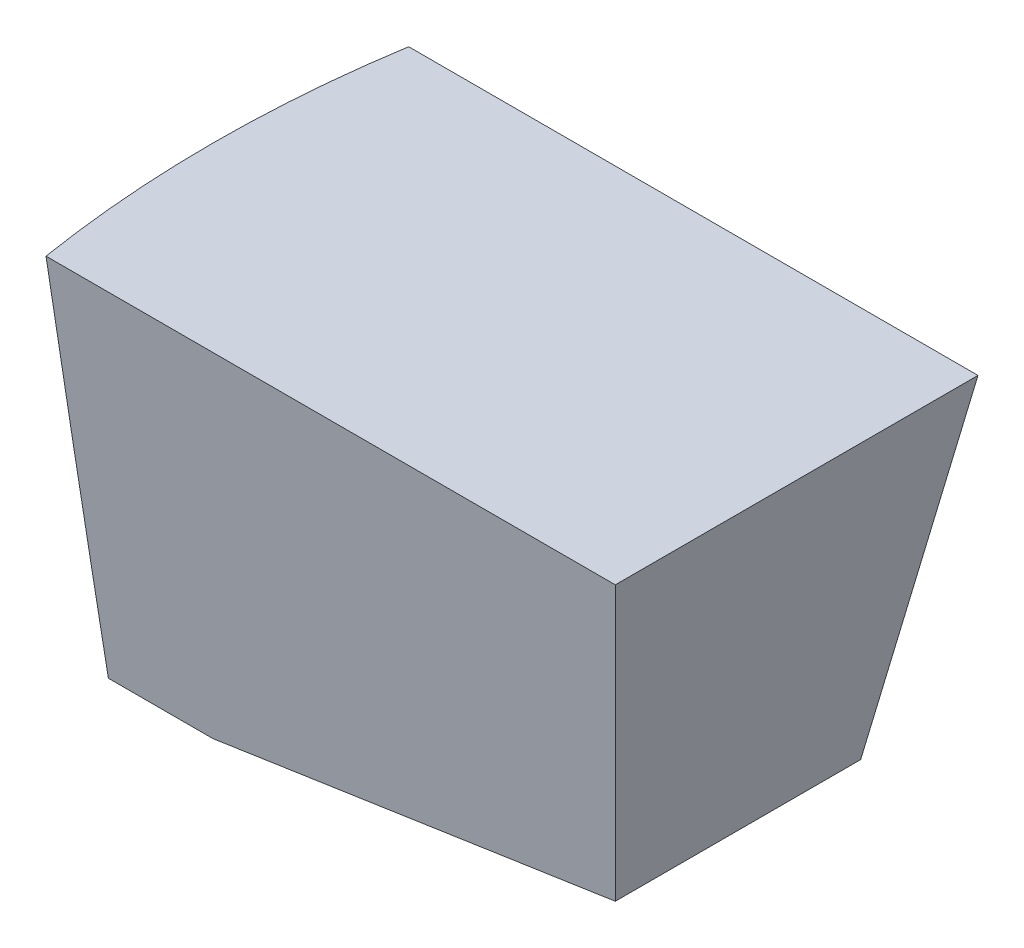
ISO-10303-21;
HEADER;
FILE_DESCRIPTION(('STEP AP214'),'2;1');
FILE_NAME('part.step','',(''),(''),'','','');
FILE_SCHEMA(('AUTOMOTIVE_DESIGN { 1 0 10303 214 1 1 1 1 }'));
ENDSEC;
DATA;
#1=APPLICATION_CONTEXT('core data for automotive mechanical design processes');
#2=APPLICATION_PROTOCOL_DEFINITION('international standard','automotive_design',2000,#1);
#3=PRODUCT_CONTEXT('',#1,'mechanical');
#4=PRODUCT('Part','Part','',(#3));
#5=PRODUCT_RELATED_PRODUCT_CATEGORY('part','',(#4));
#6=PRODUCT_DEFINITION_FORMATION('','',#4);
#7=PRODUCT_DEFINITION_CONTEXT('part definition',#1,'design');
#8=PRODUCT_DEFINITION('design','',#6,#7);
#9=PRODUCT_DEFINITION_SHAPE('','',#8);
#10=(LENGTH_UNIT() NAMED_UNIT(*) SI_UNIT(.MILLI.,.METRE.));
#11=(NAMED_UNIT(*) PLANE_ANGLE_UNIT() SI_UNIT($,.RADIAN.));
#12=(NAMED_UNIT(*) SI_UNIT($,.STERADIAN.) SOLID_ANGLE_UNIT());
#13=UNCERTAINTY_MEASURE_WITH_UNIT(LENGTH_MEASURE(1.E-05),#10,'distance_accuracy_value','');
#14=(GEOMETRIC_REPRESENTATION_CONTEXT(3) GLOBAL_UNCERTAINTY_ASSIGNED_CONTEXT((#13)) GLOBAL_UNIT_ASSIGNED_CONTEXT((#10,
#11,#12)) REPRESENTATION_CONTEXT('',''));
#15=CARTESIAN_POINT('',(0.,0.,0.));
#16=DIRECTION('',(0.,0.,1.));
#17=DIRECTION('',(1.,0.,0.));
#18=AXIS2_PLACEMENT_3D('',#15,#16,#17);
#19=CARTESIAN_POINT('',(0.,0.28184473248759,0.));
#20=DIRECTION('',(0.,1.,0.));
#21=DIRECTION('',(0.,0.,1.));
#22=AXIS2_PLACEMENT_3D('',#19,#20,#21);
#23=PLANE('',#22);
#24=DIRECTION('',(1.,0.,0.));
#25=VECTOR('',#24,1.);
#26=CARTESIAN_POINT('',(26.8738719491216,0.28184473248759,-0.125896830708122));
#27=LINE('',#26,#25);
#28=CARTESIAN_POINT('',(-0.782415834718116,0.28184473248759,-0.125896830708122));
#29=VERTEX_POINT('',#28);
#30=CARTESIAN_POINT('',(-0.38718316929188,0.281844732487589,-0.125896830708121));
#31=VERTEX_POINT('',#30);
#32=EDGE_CURVE('E112',#29,#31,#27,.T.);
#33=ORIENTED_EDGE('',*,*,#32,.F.);
#34=CARTESIAN_POINT('',(0.,0.281844732487591,0.));
#35=DIRECTION('',(0.,1.,0.));
#36=DIRECTION('',(0.,0.,1.));
#37=AXIS2_PLACEMENT_3D('',#34,#35,#36);
#38=CIRCLE('',#37,0.792479999999998);
#39=CARTESIAN_POINT('',(-0.782415834718116,0.28184473248759,0.125896830708122));
#40=VERTEX_POINT('',#39);
#41=EDGE_CURVE('E75',#29,#40,#38,.T.);
#42=ORIENTED_EDGE('',*,*,#41,.T.);
#43=DIRECTION('',(-1.,0.,0.));
#44=VECTOR('',#43,1.);
#45=CARTESIAN_POINT('',(26.8738719491216,0.28184473248759,0.125896830708122));
#46=LINE('',#45,#44);
#47=CARTESIAN_POINT('',(-0.38718316929188,0.28184473248759,0.125896830708121));
#48=VERTEX_POINT('',#47);
#49=EDGE_CURVE('E68',#48,#40,#46,.T.);
#50=ORIENTED_EDGE('',*,*,#49,.F.);
#51=DIRECTION('',(0.,0.,-1.));
#52=VECTOR('',#51,1.);
#53=CARTESIAN_POINT('',(-0.387183169291878,0.28184473248759,26.4992219491216));
#54=LINE('',#53,#52);
#55=EDGE_CURVE('E14',#48,#31,#54,.T.);
#56=ORIENTED_EDGE('',*,*,#55,.T.);
#57=EDGE_LOOP('',(#33,#42,#50,#56));
#58=FACE_BOUND('',#57,.T.);
#59=ADVANCED_FACE('F52',(#58),#23,.T.);
#60=CARTESIAN_POINT('',(0.,21.0312,0.));
#61=DIRECTION('',(0.,-1.,0.));
#62=DIRECTION('',(0.,0.,-1.));
#63=AXIS2_PLACEMENT_3D('',#60,#61,#62);
#64=CYLINDRICAL_SURFACE('',#63,0.792479999999998);
#65=ORIENTED_EDGE('',*,*,#41,.F.);
#66=CARTESIAN_POINT('',(0.,-0.432151674654869,0.));
#67=DIRECTION('',(0.,-0.173648177666931,-0.984807753012208));
#68=DIRECTION('',(0.,-0.984807753012208,0.173648177666931));
#69=AXIS2_PLACEMENT_3D('',#66,#67,#68);
#70=ELLIPSE('',#69,4.56371043248163,0.792479999999998);
#71=CARTESIAN_POINT('',(-0.788808031399274,0.,-0.0762));
#72=VERTEX_POINT('',#71);
#73=EDGE_CURVE('E114',#72,#29,#70,.T.);
#74=ORIENTED_EDGE('',*,*,#73,.F.);
#75=CARTESIAN_POINT('',(0.,0.,0.));
#76=DIRECTION('',(0.,1.,0.));
#77=DIRECTION('',(0.,0.,1.));
#78=AXIS2_PLACEMENT_3D('',#75,#76,#77);
#79=CIRCLE('',#78,0.792479999999998);
#80=CARTESIAN_POINT('',(-0.788808031399274,0.,0.0762));
#81=VERTEX_POINT('',#80);
#82=EDGE_CURVE('E109',#72,#81,#79,.T.);
#83=ORIENTED_EDGE('',*,*,#82,.T.);
#84=CARTESIAN_POINT('',(0.,-0.432151674654869,0.));
#85=DIRECTION('',(0.,-0.173648177666931,0.984807753012208));
#86=DIRECTION('',(0.,-0.984807753012208,-0.173648177666931));
#87=AXIS2_PLACEMENT_3D('',#84,#85,#86);
#88=ELLIPSE('',#87,4.56371043248163,0.792479999999998);
#89=EDGE_CURVE('E144',#40,#81,#88,.T.);
#90=ORIENTED_EDGE('',*,*,#89,.F.);
#91=EDGE_LOOP('',(#65,#74,#83,#90));
#92=FACE_BOUND('',#91,.T.);
#93=ADVANCED_FACE('F54',(#92),#64,.T.);
#94=CARTESIAN_POINT('',(26.8738719491216,0.,0.0762));
#95=DIRECTION('',(0.,-0.173648177666931,0.984807753012208));
#96=DIRECTION('',(0.,-0.984807753012208,-0.173648177666931));
#97=AXIS2_PLACEMENT_3D('',#94,#95,#96);
#98=PLANE('',#97);
#99=DIRECTION('',(-0.171087869746036,-0.970287525247814,-0.171087869746036));
#100=VECTOR('',#99,1.);
#101=CARTESIAN_POINT('',(0.362534636395632,4.53370569372685,0.875614636395637));
#102=LINE('',#101,#100);
#103=CARTESIAN_POINT('',(-0.427914365185118,0.0508466417269895,0.0851656348148848));
#104=VERTEX_POINT('',#103);
#105=EDGE_CURVE('E130',#48,#104,#102,.T.);
#106=ORIENTED_EDGE('',*,*,#105,.F.);
#107=ORIENTED_EDGE('',*,*,#49,.T.);
#108=ORIENTED_EDGE('',*,*,#89,.T.);
#109=DIRECTION('',(-1.,0.,0.));
#110=VECTOR('',#109,1.);
#111=CARTESIAN_POINT('',(26.8738719491216,0.,0.0762));
#112=LINE('',#111,#110);
#113=CARTESIAN_POINT('',(-0.71628,0.,0.0762));
#114=VERTEX_POINT('',#113);
#115=EDGE_CURVE('E137',#114,#81,#112,.T.);
#116=ORIENTED_EDGE('',*,*,#115,.F.);
#117=DIRECTION('',(-0.984346441568213,-0.173566836012846,-0.0306045161452665));
#118=VECTOR('',#117,1.);
#119=CARTESIAN_POINT('',(26.016864360068,4.71377462985435,0.907365648222384));
#120=LINE('',#119,#118);
#121=EDGE_CURVE('E133',#104,#114,#120,.T.);
#122=ORIENTED_EDGE('',*,*,#121,.F.);
#123=EDGE_LOOP('',(#106,#107,#108,#116,#122));
#124=FACE_BOUND('',#123,.T.);
#125=ADVANCED_FACE('F160',(#124),#98,.T.);
#126=CARTESIAN_POINT('',(26.8738719491216,0.,-0.0762));
#127=DIRECTION('',(0.,-0.173648177666931,-0.984807753012208));
#128=DIRECTION('',(0.,0.984807753012208,-0.173648177666931));
#129=AXIS2_PLACEMENT_3D('',#126,#127,#128);
#130=PLANE('',#129);
#131=ORIENTED_EDGE('',*,*,#73,.T.);
#132=ORIENTED_EDGE('',*,*,#32,.T.);
#133=DIRECTION('',(0.171087869746036,0.970287525247814,-0.171087869746036));
#134=VECTOR('',#133,1.);
#135=CARTESIAN_POINT('',(0.362534636395632,4.53370569372685,-0.875614636395637));
#136=LINE('',#135,#134);
#137=CARTESIAN_POINT('',(-0.427914365185118,0.0508466417269895,-0.0851656348148848));
#138=VERTEX_POINT('',#137);
#139=EDGE_CURVE('E101',#138,#31,#136,.T.);
#140=ORIENTED_EDGE('',*,*,#139,.F.);
#141=DIRECTION('',(0.984346441568213,0.173566836012846,-0.0306045161452665));
#142=VECTOR('',#141,1.);
#143=CARTESIAN_POINT('',(26.016864360068,4.71377462985435,-0.907365648222384));
#144=LINE('',#143,#142);
#145=CARTESIAN_POINT('',(-0.71628,0.,-0.0762));
#146=VERTEX_POINT('',#145);
#147=EDGE_CURVE('E61',#146,#138,#144,.T.);
#148=ORIENTED_EDGE('',*,*,#147,.F.);
#149=DIRECTION('',(-1.,0.,0.));
#150=VECTOR('',#149,1.);
#151=CARTESIAN_POINT('',(26.8738719491216,0.,-0.0762));
#152=LINE('',#151,#150);
#153=EDGE_CURVE('E141',#146,#72,#152,.T.);
#154=ORIENTED_EDGE('',*,*,#153,.T.);
#155=EDGE_LOOP('',(#131,#132,#140,#148,#154));
#156=FACE_BOUND('',#155,.T.);
#157=ADVANCED_FACE('F113',(#156),#130,.T.);
#158=CARTESIAN_POINT('',(-0.427914365185115,0.0508466417269888,26.4992219491216));
#159=DIRECTION('',(-0.984807753012208,0.173648177666931,0.));
#160=DIRECTION('',(-0.173648177666931,-0.984807753012208,0.));
#161=AXIS2_PLACEMENT_3D('',#158,#159,#160);
#162=PLANE('',#161);
#163=ORIENTED_EDGE('',*,*,#55,.F.);
#164=ORIENTED_EDGE('',*,*,#105,.T.);
#165=DIRECTION('',(0.,0.,-1.));
#166=VECTOR('',#165,1.);
#167=CARTESIAN_POINT('',(-0.427914365185115,0.0508466417269888,26.4992219491216));
#168=LINE('',#167,#166);
#169=EDGE_CURVE('E105',#104,#138,#168,.T.);
#170=ORIENTED_EDGE('',*,*,#169,.T.);
#171=ORIENTED_EDGE('',*,*,#139,.T.);
#172=EDGE_LOOP('',(#163,#164,#170,#171));
#173=FACE_BOUND('',#172,.T.);
#174=ADVANCED_FACE('F103',(#173),#162,.F.);
#175=CARTESIAN_POINT('',(0.,0.,0.));
#176=DIRECTION('',(0.,1.,0.));
#177=DIRECTION('',(0.,0.,1.));
#178=AXIS2_PLACEMENT_3D('',#175,#176,#177);
#179=PLANE('',#178);
#180=DIRECTION('',(0.,0.,-1.));
#181=VECTOR('',#180,1.);
#182=CARTESIAN_POINT('',(-0.71628,0.,26.4992219491216));
#183=LINE('',#182,#181);
#184=EDGE_CURVE('E126',#114,#146,#183,.T.);
#185=ORIENTED_EDGE('',*,*,#184,.F.);
#186=ORIENTED_EDGE('',*,*,#115,.T.);
#187=ORIENTED_EDGE('',*,*,#82,.F.);
#188=ORIENTED_EDGE('',*,*,#153,.F.);
#189=EDGE_LOOP('',(#185,#186,#187,#188));
#190=FACE_BOUND('',#189,.T.);
#191=ADVANCED_FACE('F158',(#190),#179,.F.);
#192=CARTESIAN_POINT('',(-0.71628,0.,26.4992219491216));
#193=DIRECTION('',(-0.173648177666931,0.984807753012208,0.));
#194=DIRECTION('',(-0.984807753012208,-0.173648177666931,0.));
#195=AXIS2_PLACEMENT_3D('',#192,#193,#194);
#196=PLANE('',#195);
#197=ORIENTED_EDGE('',*,*,#169,.F.);
#198=ORIENTED_EDGE('',*,*,#121,.T.);
#199=ORIENTED_EDGE('',*,*,#184,.T.);
#200=ORIENTED_EDGE('',*,*,#147,.T.);
#201=EDGE_LOOP('',(#197,#198,#199,#200));
#202=FACE_BOUND('',#201,.T.);
#203=ADVANCED_FACE('F154',(#202),#196,.F.);
#204=CLOSED_SHELL('',(#59,#93,#125,#157,#174,#191,#203));
#205=MANIFOLD_SOLID_BREP('B2',#204);
#206=ADVANCED_BREP_SHAPE_REPRESENTATION('',(#18,#205),#14);
#207=SHAPE_DEFINITION_REPRESENTATION(#9,#206);
ENDSEC;
END-ISO-10303-21;
